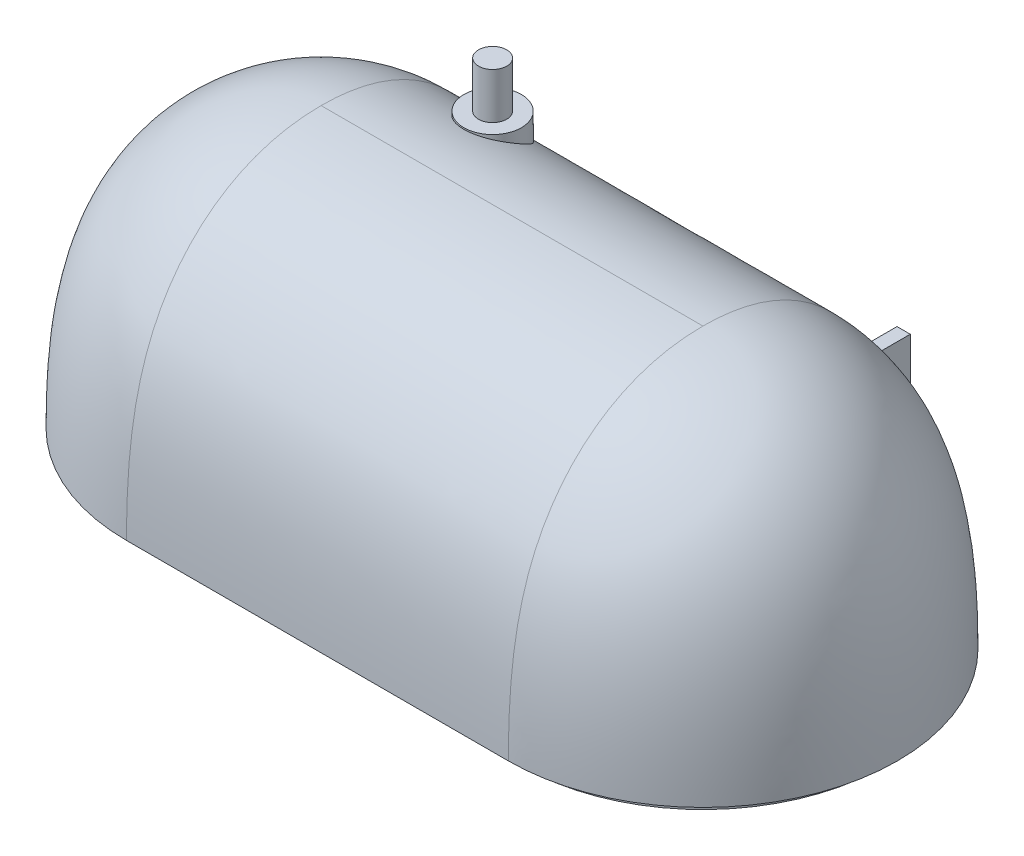
ISO-10303-21;
HEADER;
FILE_DESCRIPTION(('STEP AP214'),'2;1');
FILE_NAME('part.step','',(''),(''),'','','');
FILE_SCHEMA(('AUTOMOTIVE_DESIGN { 1 0 10303 214 1 1 1 1 }'));
ENDSEC;
DATA;
#1=APPLICATION_CONTEXT('core data for automotive mechanical design processes');
#2=APPLICATION_PROTOCOL_DEFINITION('international standard','automotive_design',2000,#1);
#3=PRODUCT_CONTEXT('',#1,'mechanical');
#4=PRODUCT('Part','Part','',(#3));
#5=PRODUCT_RELATED_PRODUCT_CATEGORY('part','',(#4));
#6=PRODUCT_DEFINITION_FORMATION('','',#4);
#7=PRODUCT_DEFINITION_CONTEXT('part definition',#1,'design');
#8=PRODUCT_DEFINITION('design','',#6,#7);
#9=PRODUCT_DEFINITION_SHAPE('','',#8);
#10=(LENGTH_UNIT() NAMED_UNIT(*) SI_UNIT(.MILLI.,.METRE.));
#11=(NAMED_UNIT(*) PLANE_ANGLE_UNIT() SI_UNIT($,.RADIAN.));
#12=(NAMED_UNIT(*) SI_UNIT($,.STERADIAN.) SOLID_ANGLE_UNIT());
#13=UNCERTAINTY_MEASURE_WITH_UNIT(LENGTH_MEASURE(1.E-05),#10,'distance_accuracy_value','');
#14=(GEOMETRIC_REPRESENTATION_CONTEXT(3) GLOBAL_UNCERTAINTY_ASSIGNED_CONTEXT((#13)) GLOBAL_UNIT_ASSIGNED_CONTEXT((#10,
#11,#12)) REPRESENTATION_CONTEXT('',''));
#15=CARTESIAN_POINT('',(0.,0.,0.));
#16=DIRECTION('',(0.,0.,1.));
#17=DIRECTION('',(1.,0.,0.));
#18=AXIS2_PLACEMENT_3D('',#15,#16,#17);
#19=CARTESIAN_POINT('',(20.745,1.19,-21.135));
#20=CARTESIAN_POINT('',(20.745,7.07644619879094,-21.135));
#21=CARTESIAN_POINT('',(20.745,21.9995349840433,-20.4011307643842));
#22=CARTESIAN_POINT('',(20.745,31.55,-8.90893662971187));
#23=CARTESIAN_POINT('',(20.745,31.55,0.));
#24=B_SPLINE_CURVE_WITH_KNOTS('',3,(#19,#20,#21,#22,#23),.UNSPECIFIED.,.F.,.F.,(4,1,4),(0.,
0.467285944025585,1.),.UNSPECIFIED.);
#25=DIRECTION('',(-1.,0.,0.));
#26=VECTOR('',#25,1.);
#27=SURFACE_OF_LINEAR_EXTRUSION('',#24,#26);
#28=DIRECTION('',(-1.,0.,0.));
#29=VECTOR('',#28,1.);
#30=CARTESIAN_POINT('',(20.745,20.11,-17.9773718902944));
#31=LINE('',#30,#29);
#32=CARTESIAN_POINT('',(19.9,20.11,-17.9773718902944));
#33=VERTEX_POINT('',#32);
#34=CARTESIAN_POINT('',(20.745,20.11,-17.9773718902945));
#35=VERTEX_POINT('',#34);
#36=EDGE_CURVE('E194',#33,#35,#31,.F.);
#37=ORIENTED_EDGE('',*,*,#36,.F.);
#38=CARTESIAN_POINT('',(19.9,1.19,-21.135));
#39=CARTESIAN_POINT('',(19.9,7.07644619879094,-21.135));
#40=CARTESIAN_POINT('',(19.9,21.9995349840433,-20.4011307643842));
#41=CARTESIAN_POINT('',(19.9,31.55,-8.90893662971187));
#42=CARTESIAN_POINT('',(19.9,31.55,0.));
#43=B_SPLINE_CURVE_WITH_KNOTS('',3,(#38,#39,#40,#41,#42),.UNSPECIFIED.,.F.,.F.,(4,1,4),(0.,
0.467285944025585,1.),.UNSPECIFIED.);
#44=CARTESIAN_POINT('',(19.9,5.16,-21.0657643610563));
#45=VERTEX_POINT('',#44);
#46=EDGE_CURVE('E46',#45,#33,#43,.T.);
#47=ORIENTED_EDGE('',*,*,#46,.F.);
#48=DIRECTION('',(-1.,0.,0.));
#49=VECTOR('',#48,1.);
#50=CARTESIAN_POINT('',(20.745,5.16,-21.0657643610563));
#51=LINE('',#50,#49);
#52=CARTESIAN_POINT('',(20.745,5.16,-21.0657643610563));
#53=VERTEX_POINT('',#52);
#54=EDGE_CURVE('E174',#45,#53,#51,.F.);
#55=ORIENTED_EDGE('',*,*,#54,.T.);
#56=CARTESIAN_POINT('',(20.745,1.19,-21.135));
#57=VERTEX_POINT('',#56);
#58=EDGE_CURVE('E335',#57,#53,#24,.T.);
#59=ORIENTED_EDGE('',*,*,#58,.F.);
#60=DIRECTION('',(-1.,0.,0.));
#61=VECTOR('',#60,1.);
#62=CARTESIAN_POINT('',(20.745,1.19,-21.135));
#63=LINE('',#62,#61);
#64=CARTESIAN_POINT('',(-20.7449999999998,1.19,-21.135));
#65=VERTEX_POINT('',#64);
#66=EDGE_CURVE('E372',#57,#65,#63,.T.);
#67=ORIENTED_EDGE('',*,*,#66,.T.);
#68=CARTESIAN_POINT('',(-20.745,1.19,-21.135));
#69=CARTESIAN_POINT('',(-20.745,7.07644619879094,-21.135));
#70=CARTESIAN_POINT('',(-20.745,21.9995349840433,-20.4011307643842));
#71=CARTESIAN_POINT('',(-20.745,31.55,-8.90893662971187));
#72=CARTESIAN_POINT('',(-20.745,31.55,0.));
#73=B_SPLINE_CURVE_WITH_KNOTS('',3,(#68,#69,#70,#71,#72),.UNSPECIFIED.,.F.,.F.,(4,1,4),(0.,
0.467285944025585,1.),.UNSPECIFIED.);
#74=CARTESIAN_POINT('',(-20.745,5.15999999988213,-21.0657643610609));
#75=VERTEX_POINT('',#74);
#76=EDGE_CURVE('E312',#65,#75,#73,.T.);
#77=ORIENTED_EDGE('',*,*,#76,.T.);
#78=DIRECTION('',(-1.,0.,0.));
#79=VECTOR('',#78,1.);
#80=CARTESIAN_POINT('',(20.745,5.16,-21.0657643610563));
#81=LINE('',#80,#79);
#82=CARTESIAN_POINT('',(-19.9,5.16,-21.0657643610563));
#83=VERTEX_POINT('',#82);
#84=EDGE_CURVE('E61',#75,#83,#81,.F.);
#85=ORIENTED_EDGE('',*,*,#84,.T.);
#86=CARTESIAN_POINT('',(-19.9,1.19,-21.135));
#87=CARTESIAN_POINT('',(-19.9,7.07644619879094,-21.135));
#88=CARTESIAN_POINT('',(-19.9,21.9995349840433,-20.4011307643842));
#89=CARTESIAN_POINT('',(-19.9,31.55,-8.90893662971187));
#90=CARTESIAN_POINT('',(-19.9,31.55,0.));
#91=B_SPLINE_CURVE_WITH_KNOTS('',3,(#86,#87,#88,#89,#90),.UNSPECIFIED.,.F.,.F.,(4,1,4),(0.,
0.467285944025585,1.),.UNSPECIFIED.);
#92=CARTESIAN_POINT('',(-19.9,20.11,-17.9773718902944));
#93=VERTEX_POINT('',#92);
#94=EDGE_CURVE('E611',#93,#83,#91,.F.);
#95=ORIENTED_EDGE('',*,*,#94,.F.);
#96=DIRECTION('',(-1.,0.,0.));
#97=VECTOR('',#96,1.);
#98=CARTESIAN_POINT('',(20.745,20.11,-17.9773718902944));
#99=LINE('',#98,#97);
#100=CARTESIAN_POINT('',(-20.7449999999999,20.11,-17.9773718902945));
#101=VERTEX_POINT('',#100);
#102=EDGE_CURVE('E217',#101,#93,#99,.F.);
#103=ORIENTED_EDGE('',*,*,#102,.F.);
#104=CARTESIAN_POINT('',(-20.745,31.55,0.));
#105=VERTEX_POINT('',#104);
#106=EDGE_CURVE('E311',#101,#105,#73,.T.);
#107=ORIENTED_EDGE('',*,*,#106,.T.);
#108=DIRECTION('',(-1.,0.,0.));
#109=VECTOR('',#108,1.);
#110=CARTESIAN_POINT('',(20.745,31.55,0.));
#111=LINE('',#110,#109);
#112=CARTESIAN_POINT('',(20.745,31.55,0.));
#113=VERTEX_POINT('',#112);
#114=EDGE_CURVE('E377',#113,#105,#111,.T.);
#115=ORIENTED_EDGE('',*,*,#114,.F.);
#116=EDGE_CURVE('E334',#35,#113,#24,.T.);
#117=ORIENTED_EDGE('',*,*,#116,.F.);
#118=EDGE_LOOP('',(#37,#47,#55,#59,#67,#77,#85,#95,#103,#107,#115,#117));
#119=FACE_BOUND('',#118,.T.);
#120=CARTESIAN_POINT('',(-11.775,26.9763033550586,-12.795));
#121=CARTESIAN_POINT('',(-11.8488364565932,26.9763032631469,-12.7950001096008));
#122=CARTESIAN_POINT('',(-11.9226751907204,26.9785606774323,-12.7923785407298));
#123=CARTESIAN_POINT('',(-12.0697133094239,26.9875299450248,-12.7819451928564));
#124=CARTESIAN_POINT('',(-12.1429126431107,26.9942421496709,-12.7741330044821));
#125=CARTESIAN_POINT('',(-12.2880929694099,27.0119547645294,-12.7534617713547));
#126=CARTESIAN_POINT('',(-12.3600735570954,27.022956571877,-12.7406010822821));
#127=CARTESIAN_POINT('',(-12.5022751329936,27.0489817133918,-12.710065078193));
#128=CARTESIAN_POINT('',(-12.5724953194683,27.0640068447752,-12.6923876114629));
#129=CARTESIAN_POINT('',(-12.7788481468459,27.1144073858168,-12.6328140327641));
#130=CARTESIAN_POINT('',(-12.9117915744368,27.1552521556176,-12.584211274097));
#131=CARTESIAN_POINT('',(-13.1664286354055,27.2486137618712,-12.4716091105439));
#132=CARTESIAN_POINT('',(-13.288114899011,27.3011381691694,-12.4075997167112));
#133=CARTESIAN_POINT('',(-13.5615690940078,27.4359647010904,-12.2406051663672));
#134=CARTESIAN_POINT('',(-13.7079809183091,27.5221198576687,-12.1319381153521));
#135=CARTESIAN_POINT('',(-13.9764700081481,27.7048988905671,-11.8951522158673));
#136=CARTESIAN_POINT('',(-14.0985140773728,27.8015367748519,-11.767007245229));
#137=CARTESIAN_POINT('',(-14.3192830475905,28.0020309776255,-11.4930765114731));
#138=CARTESIAN_POINT('',(-14.417651460655,28.1059704364592,-11.3470656980414));
#139=CARTESIAN_POINT('',(-14.588143139612,28.3160652537536,-11.0420005983073));
#140=CARTESIAN_POINT('',(-14.660267301241,28.4222205364557,-10.8829467574005));
#141=CARTESIAN_POINT('',(-14.7866356072166,28.6506940168627,-10.5282404396071));
#142=CARTESIAN_POINT('',(-14.8361686098938,28.7728789833084,-10.330805343062));
#143=CARTESIAN_POINT('',(-14.8961140180033,29.0121555483332,-9.92673563409928));
#144=CARTESIAN_POINT('',(-14.9065114178945,29.1292451762308,-9.72009752374274));
#145=CARTESIAN_POINT('',(-14.890834756011,29.2973159095271,-9.4096468772184));
#146=CARTESIAN_POINT('',(-14.8805566303795,29.3517617289248,-9.30672567620925));
#147=CARTESIAN_POINT('',(-14.8495422132593,29.4580604486665,-9.1011379075898));
#148=CARTESIAN_POINT('',(-14.8288110927841,29.5099146171524,-8.99847123927536));
#149=CARTESIAN_POINT('',(-14.7766827670244,29.6106215822845,-8.79443661325916));
#150=CARTESIAN_POINT('',(-14.7452902236154,29.6594756797526,-8.69306810798488));
#151=CARTESIAN_POINT('',(-14.6717236910163,29.7538489598668,-8.49271562445492));
#152=CARTESIAN_POINT('',(-14.6295513200374,29.7993686417395,-8.39373129073817));
#153=CARTESIAN_POINT('',(-14.5397509422728,29.8818913213261,-8.21019738618013));
#154=CARTESIAN_POINT('',(-14.4932518789415,29.9192784169933,-8.12526706188457));
#155=CARTESIAN_POINT('',(-14.3919022621309,29.990976980097,-7.95917917690942));
#156=CARTESIAN_POINT('',(-14.3370529466439,30.0252889022568,-7.87802105929412));
#157=CARTESIAN_POINT('',(-14.2192907126087,30.0906665880383,-7.72045209089336));
#158=CARTESIAN_POINT('',(-14.1563822025273,30.121734109642,-7.64403867838061));
#159=CARTESIAN_POINT('',(-14.0228719421989,30.1805237190292,-7.49685355160878));
#160=CARTESIAN_POINT('',(-13.9522709956138,30.2082461556516,-7.42608124933386));
#161=CARTESIAN_POINT('',(-13.8121590249505,30.2573712988886,-7.29859608483066));
#162=CARTESIAN_POINT('',(-13.7433989676757,30.279133950331,-7.24119484649621));
#163=CARTESIAN_POINT('',(-13.6006526988019,30.3199258649472,-7.13214914033479));
#164=CARTESIAN_POINT('',(-13.5266646787977,30.3389541753117,-7.08050668061092));
#165=CARTESIAN_POINT('',(-13.3740691708658,30.374237529105,-6.98359693301416));
#166=CARTESIAN_POINT('',(-13.2954650734645,30.3904945746158,-6.93832504692441));
#167=CARTESIAN_POINT('',(-13.1341982075021,30.4202512946039,-6.85460010237554));
#168=CARTESIAN_POINT('',(-13.0515340232778,30.4337499987199,-6.81614944419204));
#169=CARTESIAN_POINT('',(-12.8094029452075,30.4685321489745,-6.71624416428732));
#170=CARTESIAN_POINT('',(-12.6455839087576,30.4863951312953,-6.6638123599716));
#171=CARTESIAN_POINT('',(-12.3109389388678,30.5125507546848,-6.58650838208989));
#172=CARTESIAN_POINT('',(-12.1401143473664,30.5208452198508,-6.56163095572219));
#173=CARTESIAN_POINT('',(-11.8010743028078,30.5278563316656,-6.54062161380555));
#174=CARTESIAN_POINT('',(-11.6329104578562,30.5268220803503,-6.54374206698327));
#175=CARTESIAN_POINT('',(-11.2995629118704,30.5157571279994,-6.57683988462482));
#176=CARTESIAN_POINT('',(-11.1343790161278,30.5057270169368,-6.60681548785462));
#177=CARTESIAN_POINT('',(-10.8123575269439,30.4766660771527,-6.69231977411141));
#178=CARTESIAN_POINT('',(-10.6554876283676,30.4576734432771,-6.74773999503141));
#179=CARTESIAN_POINT('',(-10.3536283480753,30.410628015016,-6.88205787379232));
#180=CARTESIAN_POINT('',(-10.2086390648122,30.3825751455593,-6.96095572616394));
#181=CARTESIAN_POINT('',(-9.93232349087035,30.3169468432291,-7.14063144703786));
#182=CARTESIAN_POINT('',(-9.8012176000456,30.2792432478648,-7.24170094842589));
#183=CARTESIAN_POINT('',(-9.55810879195136,30.1946819207909,-7.46140842160346));
#184=CARTESIAN_POINT('',(-9.44610808242349,30.1478231324731,-7.58004842083551));
#185=CARTESIAN_POINT('',(-9.2394080952648,30.0433573636091,-7.83575278629399));
#186=CARTESIAN_POINT('',(-9.14554946949172,29.9854036922599,-7.97335367696927));
#187=CARTESIAN_POINT('',(-8.98204374881304,29.8607974549096,-8.25859151202543));
#188=CARTESIAN_POINT('',(-8.91240332713669,29.7941424982518,-8.40623120918278));
#189=CARTESIAN_POINT('',(-8.79343813795365,29.6479836387159,-8.71826659916991));
#190=CARTESIAN_POINT('',(-8.74597717348376,29.5678959879202,-8.88309717528755));
#191=CARTESIAN_POINT('',(-8.67872388783977,29.4004258954401,-9.21464160469605));
#192=CARTESIAN_POINT('',(-8.65894208789288,29.3130406932242,-9.38135614984906));
#193=CARTESIAN_POINT('',(-8.64520257164333,29.1231231212205,-9.73038807120265));
#194=CARTESIAN_POINT('',(-8.65421050999989,29.0199676943087,-9.91248216884768));
#195=CARTESIAN_POINT('',(-8.70283622306964,28.8093773415,-10.2700318604969));
#196=CARTESIAN_POINT('',(-8.74247504877111,28.7019395207193,-10.4454828019891));
#197=CARTESIAN_POINT('',(-8.85654531694643,28.4739093747336,-10.8046783740404));
#198=CARTESIAN_POINT('',(-8.93426886456986,28.3531483123457,-10.987275815356));
#199=CARTESIAN_POINT('',(-9.12363765131778,28.1141524028059,-11.3359119365046));
#200=CARTESIAN_POINT('',(-9.23528581466913,27.9959177743678,-11.5019491872463));
#201=CARTESIAN_POINT('',(-9.47326954540343,27.783775535073,-11.7907373382202));
#202=CARTESIAN_POINT('',(-9.59525720505146,27.6887997742093,-11.9162859972372));
#203=CARTESIAN_POINT('',(-9.86299271473558,27.5093719907938,-12.1481273511688));
#204=CARTESIAN_POINT('',(-10.0087076305359,27.4249056634654,-12.2544463118348));
#205=CARTESIAN_POINT('',(-10.2892669234595,27.2885979901769,-12.423001037173));
#206=CARTESIAN_POINT('',(-10.4198415118704,27.2336380079498,-12.489803518901));
#207=CARTESIAN_POINT('',(-10.6933412170089,27.137380736872,-12.6055784606598));
#208=CARTESIAN_POINT('',(-10.8362502176693,27.0960659502052,-12.6545737637614));
#209=CARTESIAN_POINT('',(-11.1109537326446,27.0350815756793,-12.7264527909537));
#210=CARTESIAN_POINT('',(-11.2415407883967,27.0132046716479,-12.7520155462796));
#211=CARTESIAN_POINT('',(-11.4401524477695,26.9911522031468,-12.7777298188273));
#212=CARTESIAN_POINT('',(-11.50683618222,26.9855951340735,-12.7841963178882));
#213=CARTESIAN_POINT('',(-11.6406794140586,26.9781712974721,-12.7928307230457));
#214=CARTESIAN_POINT('',(-11.7078387648566,26.9763034386609,-12.7949999003077));
#215=CARTESIAN_POINT('',(-11.775,26.9763033550586,-12.795));
#216=B_SPLINE_CURVE_WITH_KNOTS('',3,(#120,#121,#122,#123,#124,#125,#126,#127,#128,#129,#130,
#131,#132,#133,#134,#135,#136,#137,#138,#139,#140,#141,#142,#143,#144,#145,#146,#147,#148,#149,
#150,#151,#152,#153,#154,#155,#156,#157,#158,#159,#160,#161,#162,#163,#164,#165,#166,#167,#168,
#169,#170,#171,#172,#173,#174,#175,#176,#177,#178,#179,#180,#181,#182,#183,#184,#185,#186,#187,
#188,#189,#190,#191,#192,#193,#194,#195,#196,#197,#198,#199,#200,#201,#202,#203,#204,#205,#206,
#207,#208,#209,#210,#211,#212,#213,#214,#215),.UNSPECIFIED.,.T.,.F.,(4,2,2,2,2,2,2,2,2,2,2,2,2,
2,2,2,2,2,2,2,2,2,2,2,2,2,2,2,2,2,2,2,2,2,2,2,2,2,2,2,2,2,2,2,2,2,2,4),(0.,0.221432830270742,
0.442883126504617,0.664405610023417,0.886027213036861,1.32589589872422,1.76605054671236,
2.36778858922931,2.97034087169265,3.58146619362739,4.1925706554304,4.90151090828366,
5.6107229583827,5.96097845257436,6.31106084789905,6.66099036084321,7.01086737502503,
7.32181927493159,7.63272511852549,7.94346161367456,8.25416567592064,8.53033743196394,
8.80660519074675,9.0826725079874,9.35883677682383,9.87484167909054,10.3907481963314,
10.8929202562021,11.3950593846691,11.8950776512575,12.3951000610072,12.9021425293383,
13.4092435504527,13.9360346424422,14.4629707748101,15.0285398747954,15.5943238969465,
16.2201947312007,16.8464960763196,17.5403627639496,18.234289278329,18.8295134563945,
19.4239183776128,19.8920141272322,20.359507265779,20.7621624037274,20.963636094895,
21.1650501804087),.UNSPECIFIED.);
#217=CARTESIAN_POINT('',(-11.775,26.9763033550586,-12.795));
#218=VERTEX_POINT('',#217);
#219=EDGE_CURVE('E12',#218,#218,#216,.T.);
#220=ORIENTED_EDGE('',*,*,#219,.F.);
#221=EDGE_LOOP('',(#220));
#222=FACE_BOUND('',#221,.T.);
#223=ADVANCED_FACE('F33',(#119,#222),#27,.F.);
#224=CARTESIAN_POINT('',(20.7449999999998,1.19,-21.135));
#225=CARTESIAN_POINT('',(20.7449999999998,7.07644619879094,-21.135));
#226=CARTESIAN_POINT('',(20.7449999999999,21.9995349840433,-20.4011307643842));
#227=CARTESIAN_POINT('',(20.7449999999999,31.55,-8.90893662971187));
#228=CARTESIAN_POINT('',(20.745,31.55,0.));
#229=B_SPLINE_CURVE_WITH_KNOTS('',3,(#224,#225,#226,#227,#228),.UNSPECIFIED.,.F.,.F.,(4,1,4),
(0.,0.467285944025585,1.),.UNSPECIFIED.);
#230=CARTESIAN_POINT('',(20.745,31.55,0.));
#231=DIRECTION('',(0.,1.,0.));
#232=AXIS1_PLACEMENT('',#230,#231);
#233=SURFACE_OF_REVOLUTION('',#229,#232);
#234=CARTESIAN_POINT('',(20.745,20.11,0.));
#235=DIRECTION('',(0.,1.,0.));
#236=DIRECTION('',(0.,0.,1.));
#237=AXIS2_PLACEMENT_3D('',#234,#235,#236);
#238=CIRCLE('',#237,17.9773718902944);
#239=CARTESIAN_POINT('',(21.34,20.11,-17.9675227864597));
#240=VERTEX_POINT('',#239);
#241=EDGE_CURVE('E165',#35,#240,#238,.F.);
#242=ORIENTED_EDGE('',*,*,#241,.F.);
#243=ORIENTED_EDGE('',*,*,#116,.T.);
#244=CARTESIAN_POINT('',(20.745,31.55,0.));
#245=CARTESIAN_POINT('',(20.745,31.55,8.90893662971187));
#246=CARTESIAN_POINT('',(20.745,21.9995349840433,20.4011307643842));
#247=CARTESIAN_POINT('',(20.745,7.07644619879094,21.135));
#248=CARTESIAN_POINT('',(20.745,1.19,21.135));
#249=B_SPLINE_CURVE_WITH_KNOTS('',3,(#244,#245,#246,#247,#248),.UNSPECIFIED.,.F.,.F.,(4,1,4),
(0.,0.532714055974415,1.),.UNSPECIFIED.);
#250=CARTESIAN_POINT('',(20.745,1.19,21.135));
#251=VERTEX_POINT('',#250);
#252=EDGE_CURVE('E341',#113,#251,#249,.T.);
#253=ORIENTED_EDGE('',*,*,#252,.T.);
#254=CARTESIAN_POINT('',(20.745,1.19,0.));
#255=DIRECTION('',(0.,-1.,0.));
#256=DIRECTION('',(0.,0.,1.));
#257=AXIS2_PLACEMENT_3D('',#254,#255,#256);
#258=CIRCLE('',#257,21.135);
#259=EDGE_CURVE('E298',#57,#251,#258,.T.);
#260=ORIENTED_EDGE('',*,*,#259,.F.);
#261=ORIENTED_EDGE('',*,*,#58,.T.);
#262=CARTESIAN_POINT('',(20.745,5.16,0.));
#263=DIRECTION('',(0.,1.,0.));
#264=DIRECTION('',(0.,0.,1.));
#265=AXIS2_PLACEMENT_3D('',#262,#263,#264);
#266=CIRCLE('',#265,21.0657643610563);
#267=CARTESIAN_POINT('',(21.34,5.16,-21.057359832504));
#268=VERTEX_POINT('',#267);
#269=EDGE_CURVE('E249',#53,#268,#266,.F.);
#270=ORIENTED_EDGE('',*,*,#269,.T.);
#271=CARTESIAN_POINT('',(21.34,20.11,-17.9675227864597));
#272=CARTESIAN_POINT('',(21.34,19.7533835514202,-18.1385444535628));
#273=CARTESIAN_POINT('',(21.34,19.3924147036802,-18.3003152463157));
#274=CARTESIAN_POINT('',(21.34,18.6640198981061,-18.6059431139187));
#275=CARTESIAN_POINT('',(21.34,18.2966123253215,-18.7498439334626));
#276=CARTESIAN_POINT('',(21.34,17.5562078474305,-19.0210125122211));
#277=CARTESIAN_POINT('',(21.34,17.1832176719367,-19.1482987420422));
#278=CARTESIAN_POINT('',(21.34,16.4324326254981,-19.3874563992506));
#279=CARTESIAN_POINT('',(21.34,16.0546388092912,-19.4993311488164));
#280=CARTESIAN_POINT('',(21.34,15.2992510525456,-19.7076261480342));
#281=CARTESIAN_POINT('',(21.34,14.9216996104924,-19.8042012216229));
#282=CARTESIAN_POINT('',(21.34,14.1633474988759,-19.9844159091368));
#283=CARTESIAN_POINT('',(21.34,13.7825453869014,-20.0680494280238));
#284=CARTESIAN_POINT('',(21.34,13.0183946612926,-20.223355283906));
#285=CARTESIAN_POINT('',(21.34,12.635045267112,-20.2950237604377));
#286=CARTESIAN_POINT('',(21.34,11.8664885616179,-20.427331924276));
#287=CARTESIAN_POINT('',(21.34,11.4812814136766,-20.4879725638583));
#288=CARTESIAN_POINT('',(21.34,10.8503477902101,-20.5788600783459));
#289=CARTESIAN_POINT('',(21.34,10.6050491409816,-20.6121199628678));
#290=CARTESIAN_POINT('',(21.34,10.1140298121254,-20.6747922248896));
#291=CARTESIAN_POINT('',(21.34,9.86830926949034,-20.7042056742955));
#292=CARTESIAN_POINT('',(21.34,9.37649800365279,-20.7594150209274));
#293=CARTESIAN_POINT('',(21.34,9.1304073360897,-20.7852114157853));
#294=CARTESIAN_POINT('',(21.34,8.6379036767804,-20.8334077654652));
#295=CARTESIAN_POINT('',(21.34,8.39149069725067,-20.8558078454573));
#296=CARTESIAN_POINT('',(21.34,7.89662437387078,-20.8975743621487));
#297=CARTESIAN_POINT('',(21.34,7.64816909821577,-20.9169178293477));
#298=CARTESIAN_POINT('',(21.34,7.15102806694442,-20.9525888948041));
#299=CARTESIAN_POINT('',(21.34,6.90234229848592,-20.9689163134257));
#300=CARTESIAN_POINT('',(21.34,6.4047888219122,-20.9987637063898));
#301=CARTESIAN_POINT('',(21.34,6.15592110400356,-21.0122835164224));
#302=CARTESIAN_POINT('',(21.34,5.65805038761104,-21.0367214672232));
#303=CARTESIAN_POINT('',(21.34,5.40904738542398,-21.0476395327614));
#304=CARTESIAN_POINT('',(21.34,5.16,-21.057359832504));
#305=B_SPLINE_CURVE_WITH_KNOTS('',3,(#271,#272,#273,#274,#275,#276,#277,#278,#279,#280,#281,
#282,#283,#284,#285,#286,#287,#288,#289,#290,#291,#292,#293,#294,#295,#296,#297,#298,#299,#300,
#301,#302,#303,#304),.UNSPECIFIED.,.F.,.F.,(4,2,2,2,2,2,2,2,2,2,2,2,2,2,2,2,4),(0.,
1.18627095484985,2.36957821116174,3.55155856087159,4.73328371672362,5.90215877429629,
7.07158266821653,8.24138314499132,9.41108255915378,10.1536845187656,10.8960790906194,
11.6383714239353,12.3806363936308,13.1282381618266,13.8758844428445,14.62357446611,
15.371286106373),.UNSPECIFIED.);
#306=EDGE_CURVE('E241',#240,#268,#305,.T.);
#307=ORIENTED_EDGE('',*,*,#306,.F.);
#308=EDGE_LOOP('',(#242,#243,#253,#260,#261,#270,#307));
#309=FACE_BOUND('',#308,.T.);
#310=ADVANCED_FACE('F229',(#309),#233,.T.);
#311=CARTESIAN_POINT('',(-20.7449999999998,1.19,-21.135));
#312=CARTESIAN_POINT('',(-20.7449999999998,7.07644619879094,-21.135));
#313=CARTESIAN_POINT('',(-20.7449999999999,21.9995349840433,-20.4011307643842));
#314=CARTESIAN_POINT('',(-20.7449999999999,31.55,-8.90893662971187));
#315=CARTESIAN_POINT('',(-20.745,31.55,0.));
#316=B_SPLINE_CURVE_WITH_KNOTS('',3,(#311,#312,#313,#314,#315),.UNSPECIFIED.,.F.,.F.,(4,1,4),
(0.,0.467285944025585,1.),.UNSPECIFIED.);
#317=CARTESIAN_POINT('',(-20.745,31.55,0.));
#318=DIRECTION('',(0.,1.,0.));
#319=AXIS1_PLACEMENT('',#317,#318);
#320=SURFACE_OF_REVOLUTION('',#316,#319);
#321=CARTESIAN_POINT('',(-20.745,20.11,0.));
#322=DIRECTION('',(0.,1.,0.));
#323=DIRECTION('',(0.,0.,1.));
#324=AXIS2_PLACEMENT_3D('',#321,#322,#323);
#325=CIRCLE('',#324,17.9773718902945);
#326=CARTESIAN_POINT('',(-21.34,20.11,-17.9675227864597));
#327=VERTEX_POINT('',#326);
#328=EDGE_CURVE('E283',#327,#101,#325,.F.);
#329=ORIENTED_EDGE('',*,*,#328,.F.);
#330=CARTESIAN_POINT('',(-21.34,5.16,-21.057359832504));
#331=CARTESIAN_POINT('',(-21.34,5.39482053177679,-21.048194844786));
#332=CARTESIAN_POINT('',(-21.34,5.62960134858678,-21.0379649881983));
#333=CARTESIAN_POINT('',(-21.34,6.09898587874337,-21.0152055610236));
#334=CARTESIAN_POINT('',(-21.34,6.33358962316054,-21.0026766295891));
#335=CARTESIAN_POINT('',(-21.34,6.80261610282152,-20.9751463306183));
#336=CARTESIAN_POINT('',(-21.34,7.03703886061472,-20.960145349576));
#337=CARTESIAN_POINT('',(-21.34,7.50461528328976,-20.927570516027));
#338=CARTESIAN_POINT('',(-21.34,7.73776979826388,-20.9100088990254));
#339=CARTESIAN_POINT('',(-21.34,8.20388888648574,-20.8720839952138));
#340=CARTESIAN_POINT('',(-21.34,8.4368534240302,-20.8517202675364));
#341=CARTESIAN_POINT('',(-21.34,8.90258488094079,-20.8080075510299));
#342=CARTESIAN_POINT('',(-21.34,9.13535170141434,-20.7846575100889));
#343=CARTESIAN_POINT('',(-21.34,9.73522327922284,-20.7203609663851));
#344=CARTESIAN_POINT('',(-21.34,10.1020789829289,-20.6770538452837));
#345=CARTESIAN_POINT('',(-21.34,10.8347779730398,-20.5818050426417));
#346=CARTESIAN_POINT('',(-21.34,11.2006209418641,-20.5298609090996));
#347=CARTESIAN_POINT('',(-21.34,11.9307933504977,-20.4165845859822));
#348=CARTESIAN_POINT('',(-21.34,12.2951230419749,-20.355254027364));
#349=CARTESIAN_POINT('',(-21.34,13.0217599927732,-20.2224250514499));
#350=CARTESIAN_POINT('',(-21.34,13.3840681022099,-20.1509313055031));
#351=CARTESIAN_POINT('',(-21.34,14.1061479751529,-19.9969625960965));
#352=CARTESIAN_POINT('',(-21.34,14.4659210056841,-19.9144935990558));
#353=CARTESIAN_POINT('',(-21.34,15.1868244948349,-19.7366311091883));
#354=CARTESIAN_POINT('',(-21.34,15.5479199571004,-19.6410951860344));
#355=CARTESIAN_POINT('',(-21.34,16.2664361171934,-19.4369542479702));
#356=CARTESIAN_POINT('',(-21.34,16.6238565834908,-19.3283484150468));
#357=CARTESIAN_POINT('',(-21.34,17.3344391305445,-19.0970748891914));
#358=CARTESIAN_POINT('',(-21.34,17.6875976939813,-18.9743963566352));
#359=CARTESIAN_POINT('',(-21.34,18.3890592529098,-18.713908965757));
#360=CARTESIAN_POINT('',(-21.34,18.7373520596943,-18.576072542818));
#361=CARTESIAN_POINT('',(-21.34,19.4284229604636,-18.2841493819007));
#362=CARTESIAN_POINT('',(-21.34,19.7711787154095,-18.130009838121));
#363=CARTESIAN_POINT('',(-21.34,20.11,-17.9675227864597));
#364=B_SPLINE_CURVE_WITH_KNOTS('',3,(#330,#331,#332,#333,#334,#335,#336,#337,#338,#339,#340,
#341,#342,#343,#344,#345,#346,#347,#348,#349,#350,#351,#352,#353,#354,#355,#356,#357,#358,#359,
#360,#361,#362,#363),.UNSPECIFIED.,.F.,.F.,(4,2,2,2,2,2,2,2,2,2,2,2,2,2,2,2,4),(0.,
0.704998265847912,1.40980083528624,2.11449331636835,2.81592267219534,3.51746251319028,
4.21925019900666,5.32736121058326,6.43578734774147,7.54402110631325,8.65174711986489,
9.75887338730843,10.8792054970954,11.9996077621886,13.1208788965998,14.2442238769687,
15.3713257686021),.UNSPECIFIED.);
#365=CARTESIAN_POINT('',(-21.34,5.16,-21.057359832504));
#366=VERTEX_POINT('',#365);
#367=EDGE_CURVE('E276',#366,#327,#364,.T.);
#368=ORIENTED_EDGE('',*,*,#367,.F.);
#369=CARTESIAN_POINT('',(-20.745,5.16,0.));
#370=DIRECTION('',(0.,1.,0.));
#371=DIRECTION('',(0.,0.,1.));
#372=AXIS2_PLACEMENT_3D('',#369,#370,#371);
#373=CIRCLE('',#372,21.0657643610563);
#374=EDGE_CURVE('E284',#366,#75,#373,.F.);
#375=ORIENTED_EDGE('',*,*,#374,.T.);
#376=ORIENTED_EDGE('',*,*,#76,.F.);
#377=CARTESIAN_POINT('',(-20.745,1.19,0.));
#378=DIRECTION('',(0.,1.,0.));
#379=DIRECTION('',(0.,0.,1.));
#380=AXIS2_PLACEMENT_3D('',#377,#378,#379);
#381=CIRCLE('',#380,21.135);
#382=CARTESIAN_POINT('',(-20.745,1.19,21.135));
#383=VERTEX_POINT('',#382);
#384=EDGE_CURVE('E306',#65,#383,#381,.T.);
#385=ORIENTED_EDGE('',*,*,#384,.T.);
#386=CARTESIAN_POINT('',(-20.745,31.55,0.));
#387=CARTESIAN_POINT('',(-20.745,31.55,8.90893662971187));
#388=CARTESIAN_POINT('',(-20.745,21.9995349840433,20.4011307643842));
#389=CARTESIAN_POINT('',(-20.745,7.07644619879094,21.135));
#390=CARTESIAN_POINT('',(-20.745,1.19,21.135));
#391=B_SPLINE_CURVE_WITH_KNOTS('',3,(#386,#387,#388,#389,#390),.UNSPECIFIED.,.F.,.F.,(4,1,4),
(0.,0.532714055974415,1.),.UNSPECIFIED.);
#392=EDGE_CURVE('E317',#105,#383,#391,.T.);
#393=ORIENTED_EDGE('',*,*,#392,.F.);
#394=ORIENTED_EDGE('',*,*,#106,.F.);
#395=EDGE_LOOP('',(#329,#368,#375,#376,#385,#393,#394));
#396=FACE_BOUND('',#395,.T.);
#397=ADVANCED_FACE('F234',(#396),#320,.T.);
#398=CARTESIAN_POINT('',(20.745,0.,19.735));
#399=DIRECTION('',(0.,1.,0.));
#400=DIRECTION('',(0.,0.,1.));
#401=AXIS2_PLACEMENT_3D('',#398,#399,#400);
#402=PLANE('',#401);
#403=DIRECTION('',(-1.,0.,0.));
#404=VECTOR('',#403,1.);
#405=CARTESIAN_POINT('',(20.745,0.,19.735));
#406=LINE('',#405,#404);
#407=CARTESIAN_POINT('',(20.745,0.,19.735));
#408=VERTEX_POINT('',#407);
#409=CARTESIAN_POINT('',(-20.745,0.,19.735));
#410=VERTEX_POINT('',#409);
#411=EDGE_CURVE('E386',#408,#410,#406,.T.);
#412=ORIENTED_EDGE('',*,*,#411,.T.);
#413=CARTESIAN_POINT('',(-20.745,0.,0.));
#414=DIRECTION('',(0.,1.,0.));
#415=DIRECTION('',(0.,0.,1.));
#416=AXIS2_PLACEMENT_3D('',#413,#414,#415);
#417=CIRCLE('',#416,19.735);
#418=CARTESIAN_POINT('',(-20.7449999999999,0.,-19.735));
#419=VERTEX_POINT('',#418);
#420=EDGE_CURVE('E299',#419,#410,#417,.T.);
#421=ORIENTED_EDGE('',*,*,#420,.F.);
#422=DIRECTION('',(-1.,0.,0.));
#423=VECTOR('',#422,1.);
#424=CARTESIAN_POINT('',(20.745,0.,-19.735));
#425=LINE('',#424,#423);
#426=CARTESIAN_POINT('',(20.745,0.,-19.735));
#427=VERTEX_POINT('',#426);
#428=EDGE_CURVE('E366',#427,#419,#425,.T.);
#429=ORIENTED_EDGE('',*,*,#428,.F.);
#430=CARTESIAN_POINT('',(20.745,0.,0.));
#431=DIRECTION('',(0.,-1.,0.));
#432=DIRECTION('',(0.,0.,1.));
#433=AXIS2_PLACEMENT_3D('',#430,#431,#432);
#434=CIRCLE('',#433,19.735);
#435=EDGE_CURVE('E219',#427,#408,#434,.T.);
#436=ORIENTED_EDGE('',*,*,#435,.T.);
#437=EDGE_LOOP('',(#412,#421,#429,#436));
#438=FACE_BOUND('',#437,.T.);
#439=ADVANCED_FACE('F35',(#438),#402,.F.);
#440=CARTESIAN_POINT('',(20.745,0.,-19.735));
#441=DIRECTION('',(0.,0.,1.));
#442=DIRECTION('',(1.,0.,0.));
#443=AXIS2_PLACEMENT_3D('',#440,#441,#442);
#444=PLANE('',#443);
#445=ORIENTED_EDGE('',*,*,#428,.T.);
#446=DIRECTION('',(0.,1.,0.));
#447=VECTOR('',#446,1.);
#448=CARTESIAN_POINT('',(-20.745,0.,-19.735));
#449=LINE('',#448,#447);
#450=CARTESIAN_POINT('',(-20.745,1.19,-19.735));
#451=VERTEX_POINT('',#450);
#452=EDGE_CURVE('E308',#419,#451,#449,.T.);
#453=ORIENTED_EDGE('',*,*,#452,.T.);
#454=DIRECTION('',(-1.,0.,0.));
#455=VECTOR('',#454,1.);
#456=CARTESIAN_POINT('',(20.745,1.19,-19.735));
#457=LINE('',#456,#455);
#458=CARTESIAN_POINT('',(20.7449999999999,1.19,-19.735));
#459=VERTEX_POINT('',#458);
#460=EDGE_CURVE('E370',#459,#451,#457,.T.);
#461=ORIENTED_EDGE('',*,*,#460,.F.);
#462=DIRECTION('',(0.,1.,0.));
#463=VECTOR('',#462,1.);
#464=CARTESIAN_POINT('',(20.745,0.,-19.735));
#465=LINE('',#464,#463);
#466=EDGE_CURVE('E331',#427,#459,#465,.T.);
#467=ORIENTED_EDGE('',*,*,#466,.F.);
#468=EDGE_LOOP('',(#445,#453,#461,#467));
#469=FACE_BOUND('',#468,.T.);
#470=ADVANCED_FACE('F354',(#469),#444,.F.);
#471=DIRECTION('',(-1.,0.,0.));
#472=VECTOR('',#471,1.);
#473=SURFACE_OF_LINEAR_EXTRUSION('',#249,#472);
#474=ORIENTED_EDGE('',*,*,#114,.T.);
#475=ORIENTED_EDGE('',*,*,#392,.T.);
#476=DIRECTION('',(-1.,0.,0.));
#477=VECTOR('',#476,1.);
#478=CARTESIAN_POINT('',(20.745,1.19,21.135));
#479=LINE('',#478,#477);
#480=EDGE_CURVE('E380',#251,#383,#479,.T.);
#481=ORIENTED_EDGE('',*,*,#480,.F.);
#482=ORIENTED_EDGE('',*,*,#252,.F.);
#483=EDGE_LOOP('',(#474,#475,#481,#482));
#484=FACE_BOUND('',#483,.T.);
#485=ADVANCED_FACE('F353',(#484),#473,.F.);
#486=CARTESIAN_POINT('',(20.745,1.19,19.735));
#487=DIRECTION('',(0.,1.,0.));
#488=DIRECTION('',(0.,0.,1.));
#489=AXIS2_PLACEMENT_3D('',#486,#487,#488);
#490=PLANE('',#489);
#491=DIRECTION('',(-1.,0.,0.));
#492=VECTOR('',#491,1.);
#493=CARTESIAN_POINT('',(20.745,1.19,19.735));
#494=LINE('',#493,#492);
#495=CARTESIAN_POINT('',(20.745,1.19,19.735));
#496=VERTEX_POINT('',#495);
#497=CARTESIAN_POINT('',(-20.745,1.19,19.735));
#498=VERTEX_POINT('',#497);
#499=EDGE_CURVE('E383',#496,#498,#494,.T.);
#500=ORIENTED_EDGE('',*,*,#499,.F.);
#501=CARTESIAN_POINT('',(20.745,1.19,0.));
#502=DIRECTION('',(0.,-1.,0.));
#503=DIRECTION('',(0.,0.,1.));
#504=AXIS2_PLACEMENT_3D('',#501,#502,#503);
#505=CIRCLE('',#504,19.735);
#506=EDGE_CURVE('E401',#459,#496,#505,.T.);
#507=ORIENTED_EDGE('',*,*,#506,.F.);
#508=ORIENTED_EDGE('',*,*,#460,.T.);
#509=CARTESIAN_POINT('',(-20.745,1.19,0.));
#510=DIRECTION('',(0.,1.,0.));
#511=DIRECTION('',(0.,0.,1.));
#512=AXIS2_PLACEMENT_3D('',#509,#510,#511);
#513=CIRCLE('',#512,19.735);
#514=EDGE_CURVE('E304',#451,#498,#513,.T.);
#515=ORIENTED_EDGE('',*,*,#514,.T.);
#516=EDGE_LOOP('',(#500,#507,#508,#515));
#517=FACE_BOUND('',#516,.T.);
#518=ORIENTED_EDGE('',*,*,#480,.T.);
#519=ORIENTED_EDGE('',*,*,#384,.F.);
#520=ORIENTED_EDGE('',*,*,#66,.F.);
#521=ORIENTED_EDGE('',*,*,#259,.T.);
#522=EDGE_LOOP('',(#518,#519,#520,#521));
#523=FACE_BOUND('',#522,.T.);
#524=ADVANCED_FACE('F361',(#517,#523),#490,.F.);
#525=CARTESIAN_POINT('',(20.745,0.,19.735));
#526=DIRECTION('',(0.,0.,-1.));
#527=DIRECTION('',(-1.,0.,0.));
#528=AXIS2_PLACEMENT_3D('',#525,#526,#527);
#529=PLANE('',#528);
#530=ORIENTED_EDGE('',*,*,#499,.T.);
#531=DIRECTION('',(0.,-1.,0.));
#532=VECTOR('',#531,1.);
#533=CARTESIAN_POINT('',(-20.745,0.,19.735));
#534=LINE('',#533,#532);
#535=EDGE_CURVE('E325',#498,#410,#534,.T.);
#536=ORIENTED_EDGE('',*,*,#535,.T.);
#537=ORIENTED_EDGE('',*,*,#411,.F.);
#538=DIRECTION('',(0.,-1.,0.));
#539=VECTOR('',#538,1.);
#540=CARTESIAN_POINT('',(20.745,0.,19.735));
#541=LINE('',#540,#539);
#542=EDGE_CURVE('E388',#496,#408,#541,.T.);
#543=ORIENTED_EDGE('',*,*,#542,.F.);
#544=EDGE_LOOP('',(#530,#536,#537,#543));
#545=FACE_BOUND('',#544,.T.);
#546=ADVANCED_FACE('F291',(#545),#529,.F.);
#547=CARTESIAN_POINT('',(-20.745,31.55,0.));
#548=DIRECTION('',(0.,1.,0.));
#549=DIRECTION('',(0.,0.,1.));
#550=AXIS2_PLACEMENT_3D('',#547,#548,#549);
#551=CYLINDRICAL_SURFACE('',#550,19.735);
#552=ORIENTED_EDGE('',*,*,#452,.F.);
#553=ORIENTED_EDGE('',*,*,#420,.T.);
#554=ORIENTED_EDGE('',*,*,#535,.F.);
#555=ORIENTED_EDGE('',*,*,#514,.F.);
#556=EDGE_LOOP('',(#552,#553,#554,#555));
#557=FACE_BOUND('',#556,.T.);
#558=ADVANCED_FACE('F238',(#557),#551,.T.);
#559=CARTESIAN_POINT('',(20.745,31.55,0.));
#560=DIRECTION('',(0.,1.,0.));
#561=DIRECTION('',(0.,0.,1.));
#562=AXIS2_PLACEMENT_3D('',#559,#560,#561);
#563=CYLINDRICAL_SURFACE('',#562,19.735);
#564=ORIENTED_EDGE('',*,*,#466,.T.);
#565=ORIENTED_EDGE('',*,*,#506,.T.);
#566=ORIENTED_EDGE('',*,*,#542,.T.);
#567=ORIENTED_EDGE('',*,*,#435,.F.);
#568=EDGE_LOOP('',(#564,#565,#566,#567));
#569=FACE_BOUND('',#568,.T.);
#570=ADVANCED_FACE('F236',(#569),#563,.T.);
#571=CARTESIAN_POINT('',(-19.9,20.11,-16.935));
#572=DIRECTION('',(-1.,0.,0.));
#573=DIRECTION('',(0.,0.,1.));
#574=AXIS2_PLACEMENT_3D('',#571,#572,#573);
#575=PLANE('',#574);
#576=DIRECTION('',(0.,0.,-1.));
#577=VECTOR('',#576,1.);
#578=CARTESIAN_POINT('',(-19.9,20.11,-16.935));
#579=LINE('',#578,#577);
#580=CARTESIAN_POINT('',(-19.9,20.11,-21.935));
#581=VERTEX_POINT('',#580);
#582=EDGE_CURVE('E200',#93,#581,#579,.T.);
#583=ORIENTED_EDGE('',*,*,#582,.F.);
#584=ORIENTED_EDGE('',*,*,#94,.T.);
#585=DIRECTION('',(0.,0.,-1.));
#586=VECTOR('',#585,1.);
#587=CARTESIAN_POINT('',(-19.9,5.16,-16.935));
#588=LINE('',#587,#586);
#589=CARTESIAN_POINT('',(-19.9,5.16,-21.935));
#590=VERTEX_POINT('',#589);
#591=EDGE_CURVE('E208',#83,#590,#588,.T.);
#592=ORIENTED_EDGE('',*,*,#591,.T.);
#593=DIRECTION('',(0.,-1.,0.));
#594=VECTOR('',#593,1.);
#595=CARTESIAN_POINT('',(-19.9,20.11,-21.935));
#596=LINE('',#595,#594);
#597=EDGE_CURVE('E213',#581,#590,#596,.T.);
#598=ORIENTED_EDGE('',*,*,#597,.F.);
#599=EDGE_LOOP('',(#583,#584,#592,#598));
#600=FACE_BOUND('',#599,.T.);
#601=ADVANCED_FACE('F269',(#600),#575,.F.);
#602=CARTESIAN_POINT('',(-21.34,20.11,-16.935));
#603=DIRECTION('',(1.,0.,0.));
#604=DIRECTION('',(0.,0.,-1.));
#605=AXIS2_PLACEMENT_3D('',#602,#603,#604);
#606=PLANE('',#605);
#607=DIRECTION('',(0.,0.,1.));
#608=VECTOR('',#607,1.);
#609=CARTESIAN_POINT('',(-21.34,5.16,-16.935));
#610=LINE('',#609,#608);
#611=CARTESIAN_POINT('',(-21.34,5.16,-21.935));
#612=VERTEX_POINT('',#611);
#613=EDGE_CURVE('E196',#612,#366,#610,.T.);
#614=ORIENTED_EDGE('',*,*,#613,.T.);
#615=ORIENTED_EDGE('',*,*,#367,.T.);
#616=DIRECTION('',(0.,0.,1.));
#617=VECTOR('',#616,1.);
#618=CARTESIAN_POINT('',(-21.34,20.11,-16.935));
#619=LINE('',#618,#617);
#620=CARTESIAN_POINT('',(-21.34,20.11,-21.935));
#621=VERTEX_POINT('',#620);
#622=EDGE_CURVE('E197',#621,#327,#619,.T.);
#623=ORIENTED_EDGE('',*,*,#622,.F.);
#624=DIRECTION('',(0.,-1.,0.));
#625=VECTOR('',#624,1.);
#626=CARTESIAN_POINT('',(-21.34,20.11,-21.935));
#627=LINE('',#626,#625);
#628=EDGE_CURVE('E205',#621,#612,#627,.T.);
#629=ORIENTED_EDGE('',*,*,#628,.T.);
#630=EDGE_LOOP('',(#614,#615,#623,#629));
#631=FACE_BOUND('',#630,.T.);
#632=ADVANCED_FACE('F267',(#631),#606,.F.);
#633=CARTESIAN_POINT('',(-21.34,20.11,-21.935));
#634=DIRECTION('',(0.,0.,1.));
#635=DIRECTION('',(1.,0.,0.));
#636=AXIS2_PLACEMENT_3D('',#633,#634,#635);
#637=PLANE('',#636);
#638=DIRECTION('',(-1.,0.,0.));
#639=VECTOR('',#638,1.);
#640=CARTESIAN_POINT('',(-21.34,5.16,-21.935));
#641=LINE('',#640,#639);
#642=EDGE_CURVE('E201',#590,#612,#641,.T.);
#643=ORIENTED_EDGE('',*,*,#642,.T.);
#644=ORIENTED_EDGE('',*,*,#628,.F.);
#645=DIRECTION('',(-1.,0.,0.));
#646=VECTOR('',#645,1.);
#647=CARTESIAN_POINT('',(-21.34,20.11,-21.935));
#648=LINE('',#647,#646);
#649=EDGE_CURVE('E203',#581,#621,#648,.T.);
#650=ORIENTED_EDGE('',*,*,#649,.F.);
#651=ORIENTED_EDGE('',*,*,#597,.T.);
#652=EDGE_LOOP('',(#643,#644,#650,#651));
#653=FACE_BOUND('',#652,.T.);
#654=ADVANCED_FACE('F261',(#653),#637,.F.);
#655=CARTESIAN_POINT('',(0.,20.11,0.));
#656=DIRECTION('',(0.,-1.,0.));
#657=DIRECTION('',(0.,0.,-1.));
#658=AXIS2_PLACEMENT_3D('',#655,#656,#657);
#659=PLANE('',#658);
#660=ORIENTED_EDGE('',*,*,#328,.T.);
#661=ORIENTED_EDGE('',*,*,#102,.T.);
#662=ORIENTED_EDGE('',*,*,#582,.T.);
#663=ORIENTED_EDGE('',*,*,#649,.T.);
#664=ORIENTED_EDGE('',*,*,#622,.T.);
#665=EDGE_LOOP('',(#660,#661,#662,#663,#664));
#666=FACE_BOUND('',#665,.T.);
#667=ADVANCED_FACE('F257',(#666),#659,.F.);
#668=CARTESIAN_POINT('',(0.,5.16,0.));
#669=DIRECTION('',(0.,-1.,0.));
#670=DIRECTION('',(0.,0.,-1.));
#671=AXIS2_PLACEMENT_3D('',#668,#669,#670);
#672=PLANE('',#671);
#673=ORIENTED_EDGE('',*,*,#84,.F.);
#674=ORIENTED_EDGE('',*,*,#374,.F.);
#675=ORIENTED_EDGE('',*,*,#613,.F.);
#676=ORIENTED_EDGE('',*,*,#642,.F.);
#677=ORIENTED_EDGE('',*,*,#591,.F.);
#678=EDGE_LOOP('',(#673,#674,#675,#676,#677));
#679=FACE_BOUND('',#678,.T.);
#680=ADVANCED_FACE('F260',(#679),#672,.T.);
#681=CARTESIAN_POINT('',(19.9,20.11,-16.935));
#682=DIRECTION('',(1.,0.,0.));
#683=DIRECTION('',(0.,0.,-1.));
#684=AXIS2_PLACEMENT_3D('',#681,#682,#683);
#685=PLANE('',#684);
#686=DIRECTION('',(0.,0.,1.));
#687=VECTOR('',#686,1.);
#688=CARTESIAN_POINT('',(19.9,5.16,-16.935));
#689=LINE('',#688,#687);
#690=CARTESIAN_POINT('',(19.9,5.16,-21.935));
#691=VERTEX_POINT('',#690);
#692=EDGE_CURVE('E168',#691,#45,#689,.T.);
#693=ORIENTED_EDGE('',*,*,#692,.T.);
#694=ORIENTED_EDGE('',*,*,#46,.T.);
#695=DIRECTION('',(0.,0.,1.));
#696=VECTOR('',#695,1.);
#697=CARTESIAN_POINT('',(19.9,20.11,-16.935));
#698=LINE('',#697,#696);
#699=CARTESIAN_POINT('',(19.9,20.11,-21.935));
#700=VERTEX_POINT('',#699);
#701=EDGE_CURVE('E180',#700,#33,#698,.T.);
#702=ORIENTED_EDGE('',*,*,#701,.F.);
#703=DIRECTION('',(0.,-1.,0.));
#704=VECTOR('',#703,1.);
#705=CARTESIAN_POINT('',(19.9,20.11,-21.935));
#706=LINE('',#705,#704);
#707=EDGE_CURVE('E175',#700,#691,#706,.T.);
#708=ORIENTED_EDGE('',*,*,#707,.T.);
#709=EDGE_LOOP('',(#693,#694,#702,#708));
#710=FACE_BOUND('',#709,.T.);
#711=ADVANCED_FACE('F255',(#710),#685,.F.);
#712=CARTESIAN_POINT('',(21.34,20.11,-16.935));
#713=DIRECTION('',(-1.,0.,0.));
#714=DIRECTION('',(0.,0.,1.));
#715=AXIS2_PLACEMENT_3D('',#712,#713,#714);
#716=PLANE('',#715);
#717=DIRECTION('',(0.,0.,-1.));
#718=VECTOR('',#717,1.);
#719=CARTESIAN_POINT('',(21.34,20.11,-16.935));
#720=LINE('',#719,#718);
#721=CARTESIAN_POINT('',(21.34,20.11,-21.935));
#722=VERTEX_POINT('',#721);
#723=EDGE_CURVE('E157',#240,#722,#720,.T.);
#724=ORIENTED_EDGE('',*,*,#723,.F.);
#725=ORIENTED_EDGE('',*,*,#306,.T.);
#726=DIRECTION('',(0.,0.,-1.));
#727=VECTOR('',#726,1.);
#728=CARTESIAN_POINT('',(21.34,5.16,-16.935));
#729=LINE('',#728,#727);
#730=CARTESIAN_POINT('',(21.34,5.16,-21.935));
#731=VERTEX_POINT('',#730);
#732=EDGE_CURVE('E53',#268,#731,#729,.T.);
#733=ORIENTED_EDGE('',*,*,#732,.T.);
#734=DIRECTION('',(0.,-1.,0.));
#735=VECTOR('',#734,1.);
#736=CARTESIAN_POINT('',(21.34,20.11,-21.935));
#737=LINE('',#736,#735);
#738=EDGE_CURVE('E171',#722,#731,#737,.T.);
#739=ORIENTED_EDGE('',*,*,#738,.F.);
#740=EDGE_LOOP('',(#724,#725,#733,#739));
#741=FACE_BOUND('',#740,.T.);
#742=ADVANCED_FACE('F172',(#741),#716,.F.);
#743=CARTESIAN_POINT('',(21.34,20.11,-21.935));
#744=DIRECTION('',(0.,0.,1.));
#745=DIRECTION('',(1.,0.,0.));
#746=AXIS2_PLACEMENT_3D('',#743,#744,#745);
#747=PLANE('',#746);
#748=DIRECTION('',(-1.,0.,0.));
#749=VECTOR('',#748,1.);
#750=CARTESIAN_POINT('',(21.34,5.16,-21.935));
#751=LINE('',#750,#749);
#752=EDGE_CURVE('E186',#731,#691,#751,.T.);
#753=ORIENTED_EDGE('',*,*,#752,.T.);
#754=ORIENTED_EDGE('',*,*,#707,.F.);
#755=DIRECTION('',(-1.,0.,0.));
#756=VECTOR('',#755,1.);
#757=CARTESIAN_POINT('',(21.34,20.11,-21.935));
#758=LINE('',#757,#756);
#759=EDGE_CURVE('E162',#722,#700,#758,.T.);
#760=ORIENTED_EDGE('',*,*,#759,.F.);
#761=ORIENTED_EDGE('',*,*,#738,.T.);
#762=EDGE_LOOP('',(#753,#754,#760,#761));
#763=FACE_BOUND('',#762,.T.);
#764=ADVANCED_FACE('F177',(#763),#747,.F.);
#765=CARTESIAN_POINT('',(0.,20.11,0.));
#766=DIRECTION('',(0.,-1.,0.));
#767=DIRECTION('',(0.,0.,-1.));
#768=AXIS2_PLACEMENT_3D('',#765,#766,#767);
#769=PLANE('',#768);
#770=ORIENTED_EDGE('',*,*,#701,.T.);
#771=ORIENTED_EDGE('',*,*,#36,.T.);
#772=ORIENTED_EDGE('',*,*,#241,.T.);
#773=ORIENTED_EDGE('',*,*,#723,.T.);
#774=ORIENTED_EDGE('',*,*,#759,.T.);
#775=EDGE_LOOP('',(#770,#771,#772,#773,#774));
#776=FACE_BOUND('',#775,.T.);
#777=ADVANCED_FACE('F160',(#776),#769,.F.);
#778=CARTESIAN_POINT('',(0.,5.16,0.));
#779=DIRECTION('',(0.,-1.,0.));
#780=DIRECTION('',(0.,0.,-1.));
#781=AXIS2_PLACEMENT_3D('',#778,#779,#780);
#782=PLANE('',#781);
#783=ORIENTED_EDGE('',*,*,#54,.F.);
#784=ORIENTED_EDGE('',*,*,#692,.F.);
#785=ORIENTED_EDGE('',*,*,#752,.F.);
#786=ORIENTED_EDGE('',*,*,#732,.F.);
#787=ORIENTED_EDGE('',*,*,#269,.F.);
#788=EDGE_LOOP('',(#783,#784,#785,#786,#787));
#789=FACE_BOUND('',#788,.T.);
#790=ADVANCED_FACE('F519',(#789),#782,.T.);
#791=CARTESIAN_POINT('',(-11.775,70.1988347648318,-9.67));
#792=DIRECTION('',(0.,-1.,0.));
#793=DIRECTION('',(0.,0.,-1.));
#794=AXIS2_PLACEMENT_3D('',#791,#792,#793);
#795=CYLINDRICAL_SURFACE('',#794,3.125);
#796=CARTESIAN_POINT('',(-11.775,30.68,-9.67));
#797=DIRECTION('',(0.,1.,0.));
#798=DIRECTION('',(0.,0.,1.));
#799=AXIS2_PLACEMENT_3D('',#796,#797,#798);
#800=CIRCLE('',#799,3.125);
#801=CARTESIAN_POINT('',(-11.775,30.68,-6.545));
#802=VERTEX_POINT('',#801);
#803=EDGE_CURVE('E187',#802,#802,#800,.T.);
#804=ORIENTED_EDGE('',*,*,#803,.F.);
#805=EDGE_LOOP('',(#804));
#806=FACE_BOUND('',#805,.T.);
#807=ORIENTED_EDGE('',*,*,#219,.T.);
#808=EDGE_LOOP('',(#807));
#809=FACE_BOUND('',#808,.T.);
#810=ADVANCED_FACE('F527',(#806,#809),#795,.T.);
#811=CARTESIAN_POINT('',(0.,30.68,0.));
#812=DIRECTION('',(0.,1.,0.));
#813=DIRECTION('',(0.,0.,1.));
#814=AXIS2_PLACEMENT_3D('',#811,#812,#813);
#815=PLANE('',#814);
#816=CARTESIAN_POINT('',(-11.775,30.68,-9.67));
#817=DIRECTION('',(0.,1.,0.));
#818=DIRECTION('',(0.,0.,1.));
#819=AXIS2_PLACEMENT_3D('',#816,#817,#818);
#820=CIRCLE('',#819,1.535);
#821=CARTESIAN_POINT('',(-11.775,30.68,-8.135));
#822=VERTEX_POINT('',#821);
#823=EDGE_CURVE('E587',#822,#822,#820,.T.);
#824=ORIENTED_EDGE('',*,*,#823,.F.);
#825=EDGE_LOOP('',(#824));
#826=FACE_BOUND('',#825,.T.);
#827=ORIENTED_EDGE('',*,*,#803,.T.);
#828=EDGE_LOOP('',(#827));
#829=FACE_BOUND('',#828,.T.);
#830=ADVANCED_FACE('F540',(#826,#829),#815,.T.);
#831=CARTESIAN_POINT('',(-11.775,35.68,-9.67));
#832=DIRECTION('',(0.,-1.,0.));
#833=DIRECTION('',(0.,0.,-1.));
#834=AXIS2_PLACEMENT_3D('',#831,#832,#833);
#835=CYLINDRICAL_SURFACE('',#834,1.535);
#836=CARTESIAN_POINT('',(-11.775,35.68,-9.67));
#837=DIRECTION('',(0.,1.,0.));
#838=DIRECTION('',(0.,0.,1.));
#839=AXIS2_PLACEMENT_3D('',#836,#837,#838);
#840=CIRCLE('',#839,1.535);
#841=CARTESIAN_POINT('',(-11.775,35.68,-8.135));
#842=VERTEX_POINT('',#841);
#843=EDGE_CURVE('E586',#842,#842,#840,.T.);
#844=ORIENTED_EDGE('',*,*,#843,.F.);
#845=EDGE_LOOP('',(#844));
#846=FACE_BOUND('',#845,.T.);
#847=ORIENTED_EDGE('',*,*,#823,.T.);
#848=EDGE_LOOP('',(#847));
#849=FACE_BOUND('',#848,.T.);
#850=ADVANCED_FACE('F548',(#846,#849),#835,.T.);
#851=CARTESIAN_POINT('',(-11.775,35.68,-9.67));
#852=DIRECTION('',(0.,1.,0.));
#853=DIRECTION('',(0.,0.,1.));
#854=AXIS2_PLACEMENT_3D('',#851,#852,#853);
#855=PLANE('',#854);
#856=ORIENTED_EDGE('',*,*,#843,.T.);
#857=EDGE_LOOP('',(#856));
#858=FACE_BOUND('',#857,.T.);
#859=ADVANCED_FACE('F557',(#858),#855,.T.);
#860=CLOSED_SHELL('',(#223,#310,#397,#439,#470,#485,#524,#546,#558,#570,#601,#632,#654,#667,
#680,#711,#742,#764,#777,#790,#810,#830,#850,#859));
#861=MANIFOLD_SOLID_BREP('B2',#860);
#862=ADVANCED_BREP_SHAPE_REPRESENTATION('',(#18,#861),#14);
#863=SHAPE_DEFINITION_REPRESENTATION(#9,#862);
ENDSEC;
END-ISO-10303-21;
